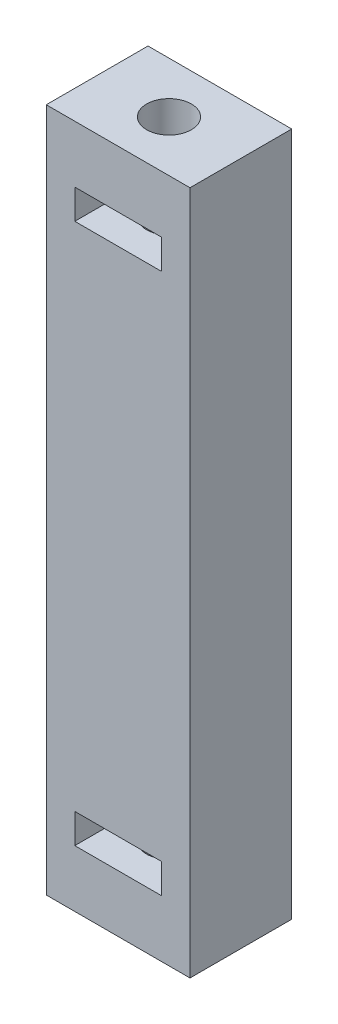
ISO-10303-21;
HEADER;
FILE_DESCRIPTION(('STEP AP214'),'2;1');
FILE_NAME('part.step','',(''),(''),'','','');
FILE_SCHEMA(('AUTOMOTIVE_DESIGN { 1 0 10303 214 1 1 1 1 }'));
ENDSEC;
DATA;
#1=APPLICATION_CONTEXT('core data for automotive mechanical design processes');
#2=APPLICATION_PROTOCOL_DEFINITION('international standard','automotive_design',2000,#1);
#3=PRODUCT_CONTEXT('',#1,'mechanical');
#4=PRODUCT('Part','Part','',(#3));
#5=PRODUCT_RELATED_PRODUCT_CATEGORY('part','',(#4));
#6=PRODUCT_DEFINITION_FORMATION('','',#4);
#7=PRODUCT_DEFINITION_CONTEXT('part definition',#1,'design');
#8=PRODUCT_DEFINITION('design','',#6,#7);
#9=PRODUCT_DEFINITION_SHAPE('','',#8);
#10=(LENGTH_UNIT() NAMED_UNIT(*) SI_UNIT(.MILLI.,.METRE.));
#11=(NAMED_UNIT(*) PLANE_ANGLE_UNIT() SI_UNIT($,.RADIAN.));
#12=(NAMED_UNIT(*) SI_UNIT($,.STERADIAN.) SOLID_ANGLE_UNIT());
#13=UNCERTAINTY_MEASURE_WITH_UNIT(LENGTH_MEASURE(1.E-05),#10,'distance_accuracy_value','');
#14=(GEOMETRIC_REPRESENTATION_CONTEXT(3) GLOBAL_UNCERTAINTY_ASSIGNED_CONTEXT((#13)) GLOBAL_UNIT_ASSIGNED_CONTEXT((#10,
#11,#12)) REPRESENTATION_CONTEXT('',''));
#15=CARTESIAN_POINT('',(0.,0.,0.));
#16=DIRECTION('',(0.,0.,1.));
#17=DIRECTION('',(1.,0.,0.));
#18=AXIS2_PLACEMENT_3D('',#15,#16,#17);
#19=CARTESIAN_POINT('',(0.,76.2,0.));
#20=DIRECTION('',(0.,1.,0.));
#21=DIRECTION('',(0.,0.,1.));
#22=AXIS2_PLACEMENT_3D('',#19,#20,#21);
#23=CYLINDRICAL_SURFACE('',#22,2.48919999999999);
#24=CARTESIAN_POINT('',(0.,69.85,0.));
#25=DIRECTION('',(0.,1.,0.));
#26=DIRECTION('',(0.,0.,1.));
#27=AXIS2_PLACEMENT_3D('',#24,#25,#26);
#28=CIRCLE('',#27,2.48919999999999);
#29=CARTESIAN_POINT('',(0.,69.85,2.48919999999999));
#30=VERTEX_POINT('',#29);
#31=EDGE_CURVE('E49',#30,#30,#28,.F.);
#32=ORIENTED_EDGE('',*,*,#31,.T.);
#33=EDGE_LOOP('',(#32));
#34=FACE_BOUND('',#33,.T.);
#35=CARTESIAN_POINT('',(0.,76.2,0.));
#36=DIRECTION('',(0.,1.,0.));
#37=DIRECTION('',(0.,0.,1.));
#38=AXIS2_PLACEMENT_3D('',#35,#36,#37);
#39=CIRCLE('',#38,2.48919999999999);
#40=CARTESIAN_POINT('',(0.,76.2,2.48919999999999));
#41=VERTEX_POINT('',#40);
#42=EDGE_CURVE('E247',#41,#41,#39,.T.);
#43=ORIENTED_EDGE('',*,*,#42,.T.);
#44=EDGE_LOOP('',(#43));
#45=FACE_BOUND('',#44,.T.);
#46=ADVANCED_FACE('F45',(#34,#45),#23,.F.);
#47=CARTESIAN_POINT('',(-8.001,76.2,-5.6642));
#48=DIRECTION('',(1.,0.,0.));
#49=DIRECTION('',(0.,0.,-1.));
#50=AXIS2_PLACEMENT_3D('',#47,#48,#49);
#51=PLANE('',#50);
#52=DIRECTION('',(0.,0.,1.));
#53=VECTOR('',#52,1.);
#54=CARTESIAN_POINT('',(-8.001,0.,-5.6642));
#55=LINE('',#54,#53);
#56=CARTESIAN_POINT('',(-8.001,0.,-5.6642));
#57=VERTEX_POINT('',#56);
#58=CARTESIAN_POINT('',(-8.001,0.,5.6642));
#59=VERTEX_POINT('',#58);
#60=EDGE_CURVE('E255',#57,#59,#55,.T.);
#61=ORIENTED_EDGE('',*,*,#60,.T.);
#62=DIRECTION('',(0.,-1.,0.));
#63=VECTOR('',#62,1.);
#64=CARTESIAN_POINT('',(-8.001,76.2,5.6642));
#65=LINE('',#64,#63);
#66=CARTESIAN_POINT('',(-8.001,76.2,5.6642));
#67=VERTEX_POINT('',#66);
#68=EDGE_CURVE('E11',#67,#59,#65,.T.);
#69=ORIENTED_EDGE('',*,*,#68,.F.);
#70=DIRECTION('',(0.,0.,1.));
#71=VECTOR('',#70,1.);
#72=CARTESIAN_POINT('',(-8.001,76.2,-5.6642));
#73=LINE('',#72,#71);
#74=CARTESIAN_POINT('',(-8.001,76.2,-5.6642));
#75=VERTEX_POINT('',#74);
#76=EDGE_CURVE('E256',#75,#67,#73,.T.);
#77=ORIENTED_EDGE('',*,*,#76,.F.);
#78=DIRECTION('',(0.,-1.,0.));
#79=VECTOR('',#78,1.);
#80=CARTESIAN_POINT('',(-8.001,76.2,-5.6642));
#81=LINE('',#80,#79);
#82=EDGE_CURVE('E270',#75,#57,#81,.T.);
#83=ORIENTED_EDGE('',*,*,#82,.T.);
#84=EDGE_LOOP('',(#61,#69,#77,#83));
#85=FACE_BOUND('',#84,.T.);
#86=ADVANCED_FACE('F47',(#85),#51,.F.);
#87=CARTESIAN_POINT('',(-8.001,76.2,5.6642));
#88=DIRECTION('',(0.,0.,-1.));
#89=DIRECTION('',(-1.,0.,0.));
#90=AXIS2_PLACEMENT_3D('',#87,#88,#89);
#91=PLANE('',#90);
#92=DIRECTION('',(1.,0.,0.));
#93=VECTOR('',#92,1.);
#94=CARTESIAN_POINT('',(-8.001,9.65200000000002,5.6642));
#95=LINE('',#94,#93);
#96=CARTESIAN_POINT('',(-4.82599999999999,9.652,5.66420000000002));
#97=VERTEX_POINT('',#96);
#98=CARTESIAN_POINT('',(4.82599999999999,9.652,5.66420000000002));
#99=VERTEX_POINT('',#98);
#100=EDGE_CURVE('E212',#97,#99,#95,.T.);
#101=ORIENTED_EDGE('',*,*,#100,.T.);
#102=DIRECTION('',(0.,-1.,0.));
#103=VECTOR('',#102,1.);
#104=CARTESIAN_POINT('',(4.82599999999999,76.2,5.6642));
#105=LINE('',#104,#103);
#106=CARTESIAN_POINT('',(4.82599999999999,6.35,5.66420000000002));
#107=VERTEX_POINT('',#106);
#108=EDGE_CURVE('E235',#99,#107,#105,.T.);
#109=ORIENTED_EDGE('',*,*,#108,.T.);
#110=DIRECTION('',(-1.,0.,0.));
#111=VECTOR('',#110,1.);
#112=CARTESIAN_POINT('',(-8.001,6.35000000000001,5.6642));
#113=LINE('',#112,#111);
#114=CARTESIAN_POINT('',(-4.82599999999999,6.35000000000001,5.6642));
#115=VERTEX_POINT('',#114);
#116=EDGE_CURVE('E208',#107,#115,#113,.T.);
#117=ORIENTED_EDGE('',*,*,#116,.T.);
#118=DIRECTION('',(0.,1.,0.));
#119=VECTOR('',#118,1.);
#120=CARTESIAN_POINT('',(-4.82599999999999,76.2,5.6642));
#121=LINE('',#120,#119);
#122=EDGE_CURVE('E148',#115,#97,#121,.T.);
#123=ORIENTED_EDGE('',*,*,#122,.T.);
#124=EDGE_LOOP('',(#101,#109,#117,#123));
#125=FACE_BOUND('',#124,.T.);
#126=DIRECTION('',(1.,0.,0.));
#127=VECTOR('',#126,1.);
#128=CARTESIAN_POINT('',(-8.001,69.85,5.6642));
#129=LINE('',#128,#127);
#130=CARTESIAN_POINT('',(-4.826,69.85,5.66420000000002));
#131=VERTEX_POINT('',#130);
#132=CARTESIAN_POINT('',(4.826,69.85,5.66420000000002));
#133=VERTEX_POINT('',#132);
#134=EDGE_CURVE('E221',#131,#133,#129,.T.);
#135=ORIENTED_EDGE('',*,*,#134,.T.);
#136=DIRECTION('',(0.,-1.,0.));
#137=VECTOR('',#136,1.);
#138=CARTESIAN_POINT('',(4.826,76.2,5.6642));
#139=LINE('',#138,#137);
#140=CARTESIAN_POINT('',(4.826,66.548,5.66420000000002));
#141=VERTEX_POINT('',#140);
#142=EDGE_CURVE('E229',#133,#141,#139,.T.);
#143=ORIENTED_EDGE('',*,*,#142,.T.);
#144=DIRECTION('',(-1.,0.,0.));
#145=VECTOR('',#144,1.);
#146=CARTESIAN_POINT('',(-8.001,66.548,5.6642));
#147=LINE('',#146,#145);
#148=CARTESIAN_POINT('',(-4.826,66.548,5.6642));
#149=VERTEX_POINT('',#148);
#150=EDGE_CURVE('E217',#141,#149,#147,.T.);
#151=ORIENTED_EDGE('',*,*,#150,.T.);
#152=DIRECTION('',(0.,1.,0.));
#153=VECTOR('',#152,1.);
#154=CARTESIAN_POINT('',(-4.826,76.2,5.6642));
#155=LINE('',#154,#153);
#156=EDGE_CURVE('E225',#149,#131,#155,.T.);
#157=ORIENTED_EDGE('',*,*,#156,.T.);
#158=EDGE_LOOP('',(#135,#143,#151,#157));
#159=FACE_BOUND('',#158,.T.);
#160=DIRECTION('',(1.,0.,0.));
#161=VECTOR('',#160,1.);
#162=CARTESIAN_POINT('',(-8.001,0.,5.6642));
#163=LINE('',#162,#161);
#164=CARTESIAN_POINT('',(8.001,0.,5.6642));
#165=VERTEX_POINT('',#164);
#166=EDGE_CURVE('E274',#59,#165,#163,.T.);
#167=ORIENTED_EDGE('',*,*,#166,.T.);
#168=DIRECTION('',(0.,-1.,0.));
#169=VECTOR('',#168,1.);
#170=CARTESIAN_POINT('',(8.001,76.2,5.6642));
#171=LINE('',#170,#169);
#172=CARTESIAN_POINT('',(8.001,76.2,5.6642));
#173=VERTEX_POINT('',#172);
#174=EDGE_CURVE('E55',#173,#165,#171,.T.);
#175=ORIENTED_EDGE('',*,*,#174,.F.);
#176=DIRECTION('',(1.,0.,0.));
#177=VECTOR('',#176,1.);
#178=CARTESIAN_POINT('',(-8.001,76.2,5.6642));
#179=LINE('',#178,#177);
#180=EDGE_CURVE('E260',#67,#173,#179,.T.);
#181=ORIENTED_EDGE('',*,*,#180,.F.);
#182=ORIENTED_EDGE('',*,*,#68,.T.);
#183=EDGE_LOOP('',(#167,#175,#181,#182));
#184=FACE_BOUND('',#183,.T.);
#185=ADVANCED_FACE('F320',(#125,#159,#184),#91,.F.);
#186=CARTESIAN_POINT('',(8.001,76.2,-5.6642));
#187=DIRECTION('',(-1.,0.,0.));
#188=DIRECTION('',(0.,0.,1.));
#189=AXIS2_PLACEMENT_3D('',#186,#187,#188);
#190=PLANE('',#189);
#191=DIRECTION('',(0.,0.,-1.));
#192=VECTOR('',#191,1.);
#193=CARTESIAN_POINT('',(8.001,0.,-5.6642));
#194=LINE('',#193,#192);
#195=CARTESIAN_POINT('',(8.001,0.,-5.6642));
#196=VERTEX_POINT('',#195);
#197=EDGE_CURVE('E277',#165,#196,#194,.T.);
#198=ORIENTED_EDGE('',*,*,#197,.T.);
#199=DIRECTION('',(0.,-1.,0.));
#200=VECTOR('',#199,1.);
#201=CARTESIAN_POINT('',(8.001,76.2,-5.6642));
#202=LINE('',#201,#200);
#203=CARTESIAN_POINT('',(8.001,76.2,-5.6642));
#204=VERTEX_POINT('',#203);
#205=EDGE_CURVE('E285',#204,#196,#202,.T.);
#206=ORIENTED_EDGE('',*,*,#205,.F.);
#207=DIRECTION('',(0.,0.,-1.));
#208=VECTOR('',#207,1.);
#209=CARTESIAN_POINT('',(8.001,76.2,-5.6642));
#210=LINE('',#209,#208);
#211=EDGE_CURVE('E264',#173,#204,#210,.T.);
#212=ORIENTED_EDGE('',*,*,#211,.F.);
#213=ORIENTED_EDGE('',*,*,#174,.T.);
#214=EDGE_LOOP('',(#198,#206,#212,#213));
#215=FACE_BOUND('',#214,.T.);
#216=ADVANCED_FACE('F367',(#215),#190,.F.);
#217=CARTESIAN_POINT('',(-8.001,76.2,-5.6642));
#218=DIRECTION('',(0.,0.,1.));
#219=DIRECTION('',(1.,0.,0.));
#220=AXIS2_PLACEMENT_3D('',#217,#218,#219);
#221=PLANE('',#220);
#222=DIRECTION('',(-1.,0.,0.));
#223=VECTOR('',#222,1.);
#224=CARTESIAN_POINT('',(4.82599999999999,6.35,-5.6642));
#225=LINE('',#224,#223);
#226=CARTESIAN_POINT('',(4.82599999999999,6.35000000000001,-5.6642));
#227=VERTEX_POINT('',#226);
#228=CARTESIAN_POINT('',(-4.82599999999999,6.35,-5.6642));
#229=VERTEX_POINT('',#228);
#230=EDGE_CURVE('E156',#227,#229,#225,.T.);
#231=ORIENTED_EDGE('',*,*,#230,.F.);
#232=DIRECTION('',(0.,-1.,0.));
#233=VECTOR('',#232,1.);
#234=CARTESIAN_POINT('',(4.82599999999999,9.652,-5.6642));
#235=LINE('',#234,#233);
#236=CARTESIAN_POINT('',(4.82599999999999,9.652,-5.6642));
#237=VERTEX_POINT('',#236);
#238=EDGE_CURVE('E162',#237,#227,#235,.T.);
#239=ORIENTED_EDGE('',*,*,#238,.F.);
#240=DIRECTION('',(1.,0.,0.));
#241=VECTOR('',#240,1.);
#242=CARTESIAN_POINT('',(4.82599999999999,9.652,-5.6642));
#243=LINE('',#242,#241);
#244=CARTESIAN_POINT('',(-4.82599999999999,9.652,-5.6642));
#245=VERTEX_POINT('',#244);
#246=EDGE_CURVE('E167',#245,#237,#243,.T.);
#247=ORIENTED_EDGE('',*,*,#246,.F.);
#248=DIRECTION('',(0.,1.,0.));
#249=VECTOR('',#248,1.);
#250=CARTESIAN_POINT('',(-4.82599999999999,9.652,-5.6642));
#251=LINE('',#250,#249);
#252=EDGE_CURVE('E145',#229,#245,#251,.T.);
#253=ORIENTED_EDGE('',*,*,#252,.F.);
#254=EDGE_LOOP('',(#231,#239,#247,#253));
#255=FACE_BOUND('',#254,.T.);
#256=DIRECTION('',(-1.,0.,0.));
#257=VECTOR('',#256,1.);
#258=CARTESIAN_POINT('',(4.826,66.548,-5.6642));
#259=LINE('',#258,#257);
#260=CARTESIAN_POINT('',(4.826,66.548,-5.6642));
#261=VERTEX_POINT('',#260);
#262=CARTESIAN_POINT('',(-4.826,66.548,-5.6642));
#263=VERTEX_POINT('',#262);
#264=EDGE_CURVE('E202',#261,#263,#259,.T.);
#265=ORIENTED_EDGE('',*,*,#264,.F.);
#266=DIRECTION('',(0.,-1.,0.));
#267=VECTOR('',#266,1.);
#268=CARTESIAN_POINT('',(4.826,69.85,-5.6642));
#269=LINE('',#268,#267);
#270=CARTESIAN_POINT('',(4.826,69.85,-5.6642));
#271=VERTEX_POINT('',#270);
#272=EDGE_CURVE('E205',#271,#261,#269,.T.);
#273=ORIENTED_EDGE('',*,*,#272,.F.);
#274=DIRECTION('',(1.,0.,0.));
#275=VECTOR('',#274,1.);
#276=CARTESIAN_POINT('',(4.826,69.85,-5.6642));
#277=LINE('',#276,#275);
#278=CARTESIAN_POINT('',(-4.826,69.85,-5.6642));
#279=VERTEX_POINT('',#278);
#280=EDGE_CURVE('E186',#279,#271,#277,.T.);
#281=ORIENTED_EDGE('',*,*,#280,.F.);
#282=DIRECTION('',(0.,1.,0.));
#283=VECTOR('',#282,1.);
#284=CARTESIAN_POINT('',(-4.826,69.85,-5.6642));
#285=LINE('',#284,#283);
#286=EDGE_CURVE('E198',#263,#279,#285,.T.);
#287=ORIENTED_EDGE('',*,*,#286,.F.);
#288=EDGE_LOOP('',(#265,#273,#281,#287));
#289=FACE_BOUND('',#288,.T.);
#290=DIRECTION('',(-1.,0.,0.));
#291=VECTOR('',#290,1.);
#292=CARTESIAN_POINT('',(-8.001,0.,-5.6642));
#293=LINE('',#292,#291);
#294=EDGE_CURVE('E261',#196,#57,#293,.T.);
#295=ORIENTED_EDGE('',*,*,#294,.T.);
#296=ORIENTED_EDGE('',*,*,#82,.F.);
#297=DIRECTION('',(-1.,0.,0.));
#298=VECTOR('',#297,1.);
#299=CARTESIAN_POINT('',(-8.001,76.2,-5.6642));
#300=LINE('',#299,#298);
#301=EDGE_CURVE('E267',#204,#75,#300,.T.);
#302=ORIENTED_EDGE('',*,*,#301,.F.);
#303=ORIENTED_EDGE('',*,*,#205,.T.);
#304=EDGE_LOOP('',(#295,#296,#302,#303));
#305=FACE_BOUND('',#304,.T.);
#306=ADVANCED_FACE('F164',(#255,#289,#305),#221,.F.);
#307=CARTESIAN_POINT('',(0.,76.2,0.));
#308=DIRECTION('',(0.,1.,0.));
#309=DIRECTION('',(0.,0.,1.));
#310=AXIS2_PLACEMENT_3D('',#307,#308,#309);
#311=PLANE('',#310);
#312=ORIENTED_EDGE('',*,*,#42,.F.);
#313=EDGE_LOOP('',(#312));
#314=FACE_BOUND('',#313,.T.);
#315=ORIENTED_EDGE('',*,*,#76,.T.);
#316=ORIENTED_EDGE('',*,*,#180,.T.);
#317=ORIENTED_EDGE('',*,*,#211,.T.);
#318=ORIENTED_EDGE('',*,*,#301,.T.);
#319=EDGE_LOOP('',(#315,#316,#317,#318));
#320=FACE_BOUND('',#319,.T.);
#321=ADVANCED_FACE('F358',(#314,#320),#311,.T.);
#322=CARTESIAN_POINT('',(0.,0.,0.));
#323=DIRECTION('',(0.,1.,0.));
#324=DIRECTION('',(0.,0.,1.));
#325=AXIS2_PLACEMENT_3D('',#322,#323,#324);
#326=PLANE('',#325);
#327=CARTESIAN_POINT('',(0.,0.,0.));
#328=DIRECTION('',(0.,-1.,0.));
#329=DIRECTION('',(0.,0.,-1.));
#330=AXIS2_PLACEMENT_3D('',#327,#328,#329);
#331=CIRCLE('',#330,2.48919999999999);
#332=CARTESIAN_POINT('',(0.,0.,-2.48919999999999));
#333=VERTEX_POINT('',#332);
#334=EDGE_CURVE('E239',#333,#333,#331,.T.);
#335=ORIENTED_EDGE('',*,*,#334,.F.);
#336=EDGE_LOOP('',(#335));
#337=FACE_BOUND('',#336,.T.);
#338=ORIENTED_EDGE('',*,*,#60,.F.);
#339=ORIENTED_EDGE('',*,*,#294,.F.);
#340=ORIENTED_EDGE('',*,*,#197,.F.);
#341=ORIENTED_EDGE('',*,*,#166,.F.);
#342=EDGE_LOOP('',(#338,#339,#340,#341));
#343=FACE_BOUND('',#342,.T.);
#344=ADVANCED_FACE('F360',(#337,#343),#326,.F.);
#345=CARTESIAN_POINT('',(0.,0.,0.));
#346=DIRECTION('',(0.,-1.,0.));
#347=DIRECTION('',(0.,0.,-1.));
#348=AXIS2_PLACEMENT_3D('',#345,#346,#347);
#349=CYLINDRICAL_SURFACE('',#348,2.48919999999999);
#350=CARTESIAN_POINT('',(0.,6.35,0.));
#351=DIRECTION('',(0.,-1.,0.));
#352=DIRECTION('',(0.,0.,-1.));
#353=AXIS2_PLACEMENT_3D('',#350,#351,#352);
#354=CIRCLE('',#353,2.48919999999999);
#355=CARTESIAN_POINT('',(0.,6.35,-2.48919999999999));
#356=VERTEX_POINT('',#355);
#357=EDGE_CURVE('E177',#356,#356,#354,.F.);
#358=ORIENTED_EDGE('',*,*,#357,.T.);
#359=EDGE_LOOP('',(#358));
#360=FACE_BOUND('',#359,.T.);
#361=ORIENTED_EDGE('',*,*,#334,.T.);
#362=EDGE_LOOP('',(#361));
#363=FACE_BOUND('',#362,.T.);
#364=ADVANCED_FACE('F363',(#360,#363),#349,.F.);
#365=CARTESIAN_POINT('',(4.82599999999999,9.652,70.5358));
#366=DIRECTION('',(1.,0.,0.));
#367=DIRECTION('',(0.,0.,-1.));
#368=AXIS2_PLACEMENT_3D('',#365,#366,#367);
#369=PLANE('',#368);
#370=DIRECTION('',(0.,0.,-1.));
#371=VECTOR('',#370,1.);
#372=CARTESIAN_POINT('',(4.82599999999999,9.652,70.5358));
#373=LINE('',#372,#371);
#374=EDGE_CURVE('E174',#99,#237,#373,.T.);
#375=ORIENTED_EDGE('',*,*,#374,.T.);
#376=ORIENTED_EDGE('',*,*,#238,.T.);
#377=DIRECTION('',(0.,0.,-1.));
#378=VECTOR('',#377,1.);
#379=CARTESIAN_POINT('',(4.82599999999999,6.35,70.5358));
#380=LINE('',#379,#378);
#381=EDGE_CURVE('E152',#107,#227,#380,.T.);
#382=ORIENTED_EDGE('',*,*,#381,.F.);
#383=ORIENTED_EDGE('',*,*,#108,.F.);
#384=EDGE_LOOP('',(#375,#376,#382,#383));
#385=FACE_BOUND('',#384,.T.);
#386=ADVANCED_FACE('F377',(#385),#369,.F.);
#387=CARTESIAN_POINT('',(-4.82599999999999,9.652,70.5358));
#388=DIRECTION('',(-1.,0.,0.));
#389=DIRECTION('',(0.,0.,1.));
#390=AXIS2_PLACEMENT_3D('',#387,#388,#389);
#391=PLANE('',#390);
#392=DIRECTION('',(0.,0.,-1.));
#393=VECTOR('',#392,1.);
#394=CARTESIAN_POINT('',(-4.82599999999999,6.35,70.5358));
#395=LINE('',#394,#393);
#396=EDGE_CURVE('E63',#115,#229,#395,.T.);
#397=ORIENTED_EDGE('',*,*,#396,.T.);
#398=ORIENTED_EDGE('',*,*,#252,.T.);
#399=DIRECTION('',(0.,0.,-1.));
#400=VECTOR('',#399,1.);
#401=CARTESIAN_POINT('',(-4.82599999999999,9.652,70.5358));
#402=LINE('',#401,#400);
#403=EDGE_CURVE('E151',#97,#245,#402,.T.);
#404=ORIENTED_EDGE('',*,*,#403,.F.);
#405=ORIENTED_EDGE('',*,*,#122,.F.);
#406=EDGE_LOOP('',(#397,#398,#404,#405));
#407=FACE_BOUND('',#406,.T.);
#408=ADVANCED_FACE('F142',(#407),#391,.F.);
#409=CARTESIAN_POINT('',(4.82599999999999,9.652,70.5358));
#410=DIRECTION('',(0.,1.,0.));
#411=DIRECTION('',(0.,0.,1.));
#412=AXIS2_PLACEMENT_3D('',#409,#410,#411);
#413=PLANE('',#412);
#414=CARTESIAN_POINT('',(0.,9.652,0.));
#415=DIRECTION('',(0.,1.,0.));
#416=DIRECTION('',(0.,0.,1.));
#417=AXIS2_PLACEMENT_3D('',#414,#415,#416);
#418=CIRCLE('',#417,2.48919999999999);
#419=CARTESIAN_POINT('',(0.,9.652,2.48919999999999));
#420=VERTEX_POINT('',#419);
#421=EDGE_CURVE('E211',#420,#420,#418,.F.);
#422=ORIENTED_EDGE('',*,*,#421,.F.);
#423=EDGE_LOOP('',(#422));
#424=FACE_BOUND('',#423,.T.);
#425=ORIENTED_EDGE('',*,*,#403,.T.);
#426=ORIENTED_EDGE('',*,*,#246,.T.);
#427=ORIENTED_EDGE('',*,*,#374,.F.);
#428=ORIENTED_EDGE('',*,*,#100,.F.);
#429=EDGE_LOOP('',(#425,#426,#427,#428));
#430=FACE_BOUND('',#429,.T.);
#431=ADVANCED_FACE('F375',(#424,#430),#413,.F.);
#432=CARTESIAN_POINT('',(4.82599999999999,6.35,70.5358));
#433=DIRECTION('',(0.,-1.,0.));
#434=DIRECTION('',(0.,0.,-1.));
#435=AXIS2_PLACEMENT_3D('',#432,#433,#434);
#436=PLANE('',#435);
#437=ORIENTED_EDGE('',*,*,#357,.F.);
#438=EDGE_LOOP('',(#437));
#439=FACE_BOUND('',#438,.T.);
#440=ORIENTED_EDGE('',*,*,#381,.T.);
#441=ORIENTED_EDGE('',*,*,#230,.T.);
#442=ORIENTED_EDGE('',*,*,#396,.F.);
#443=ORIENTED_EDGE('',*,*,#116,.F.);
#444=EDGE_LOOP('',(#440,#441,#442,#443));
#445=FACE_BOUND('',#444,.T.);
#446=ADVANCED_FACE('F157',(#439,#445),#436,.F.);
#447=CARTESIAN_POINT('',(0.,15.24,0.));
#448=DIRECTION('',(0.,-1.,0.));
#449=DIRECTION('',(0.,0.,-1.));
#450=AXIS2_PLACEMENT_3D('',#447,#448,#449);
#451=CONICAL_SURFACE('',#450,2.48919999999999,1.02974425867665);
#452=CARTESIAN_POINT('',(0.,16.7356622528834,0.));
#453=VERTEX_POINT('',#452);
#454=VERTEX_LOOP('',#453);
#455=FACE_BOUND('',#454,.T.);
#456=CARTESIAN_POINT('',(0.,15.24,0.));
#457=DIRECTION('',(0.,-1.,0.));
#458=DIRECTION('',(0.,0.,-1.));
#459=AXIS2_PLACEMENT_3D('',#456,#457,#458);
#460=CIRCLE('',#459,2.48919999999999);
#461=CARTESIAN_POINT('',(0.,15.24,-2.48919999999999));
#462=VERTEX_POINT('',#461);
#463=EDGE_CURVE('E243',#462,#462,#460,.T.);
#464=ORIENTED_EDGE('',*,*,#463,.T.);
#465=EDGE_LOOP('',(#464));
#466=FACE_BOUND('',#465,.T.);
#467=ADVANCED_FACE('F394',(#455,#466),#451,.F.);
#468=ORIENTED_EDGE('',*,*,#421,.T.);
#469=EDGE_LOOP('',(#468));
#470=FACE_BOUND('',#469,.T.);
#471=ORIENTED_EDGE('',*,*,#463,.F.);
#472=EDGE_LOOP('',(#471));
#473=FACE_BOUND('',#472,.T.);
#474=ADVANCED_FACE('F387',(#470,#473),#349,.F.);
#475=CARTESIAN_POINT('',(4.826,69.85,70.5358));
#476=DIRECTION('',(1.,0.,0.));
#477=DIRECTION('',(0.,1.,0.));
#478=AXIS2_PLACEMENT_3D('',#475,#476,#477);
#479=PLANE('',#478);
#480=DIRECTION('',(0.,0.,-1.));
#481=VECTOR('',#480,1.);
#482=CARTESIAN_POINT('',(4.826,69.85,70.5358));
#483=LINE('',#482,#481);
#484=EDGE_CURVE('E192',#133,#271,#483,.T.);
#485=ORIENTED_EDGE('',*,*,#484,.T.);
#486=ORIENTED_EDGE('',*,*,#272,.T.);
#487=DIRECTION('',(0.,0.,-1.));
#488=VECTOR('',#487,1.);
#489=CARTESIAN_POINT('',(4.826,66.548,70.5358));
#490=LINE('',#489,#488);
#491=EDGE_CURVE('E182',#141,#261,#490,.T.);
#492=ORIENTED_EDGE('',*,*,#491,.F.);
#493=ORIENTED_EDGE('',*,*,#142,.F.);
#494=EDGE_LOOP('',(#485,#486,#492,#493));
#495=FACE_BOUND('',#494,.T.);
#496=ADVANCED_FACE('F323',(#495),#479,.F.);
#497=CARTESIAN_POINT('',(-4.826,69.85,70.5358));
#498=DIRECTION('',(-1.,0.,0.));
#499=DIRECTION('',(0.,-1.,0.));
#500=AXIS2_PLACEMENT_3D('',#497,#498,#499);
#501=PLANE('',#500);
#502=DIRECTION('',(0.,0.,-1.));
#503=VECTOR('',#502,1.);
#504=CARTESIAN_POINT('',(-4.826,66.548,70.5358));
#505=LINE('',#504,#503);
#506=EDGE_CURVE('E71',#149,#263,#505,.T.);
#507=ORIENTED_EDGE('',*,*,#506,.T.);
#508=ORIENTED_EDGE('',*,*,#286,.T.);
#509=DIRECTION('',(0.,0.,-1.));
#510=VECTOR('',#509,1.);
#511=CARTESIAN_POINT('',(-4.826,69.85,70.5358));
#512=LINE('',#511,#510);
#513=EDGE_CURVE('E189',#131,#279,#512,.T.);
#514=ORIENTED_EDGE('',*,*,#513,.F.);
#515=ORIENTED_EDGE('',*,*,#156,.F.);
#516=EDGE_LOOP('',(#507,#508,#514,#515));
#517=FACE_BOUND('',#516,.T.);
#518=ADVANCED_FACE('F318',(#517),#501,.F.);
#519=CARTESIAN_POINT('',(4.826,69.85,70.5358));
#520=DIRECTION('',(0.,1.,0.));
#521=DIRECTION('',(0.,0.,1.));
#522=AXIS2_PLACEMENT_3D('',#519,#520,#521);
#523=PLANE('',#522);
#524=ORIENTED_EDGE('',*,*,#31,.F.);
#525=EDGE_LOOP('',(#524));
#526=FACE_BOUND('',#525,.T.);
#527=ORIENTED_EDGE('',*,*,#513,.T.);
#528=ORIENTED_EDGE('',*,*,#280,.T.);
#529=ORIENTED_EDGE('',*,*,#484,.F.);
#530=ORIENTED_EDGE('',*,*,#134,.F.);
#531=EDGE_LOOP('',(#527,#528,#529,#530));
#532=FACE_BOUND('',#531,.T.);
#533=ADVANCED_FACE('F307',(#526,#532),#523,.F.);
#534=CARTESIAN_POINT('',(4.826,66.548,70.5358));
#535=DIRECTION('',(0.,-1.,0.));
#536=DIRECTION('',(0.,0.,-1.));
#537=AXIS2_PLACEMENT_3D('',#534,#535,#536);
#538=PLANE('',#537);
#539=CARTESIAN_POINT('',(0.,66.548,0.));
#540=DIRECTION('',(0.,-1.,0.));
#541=DIRECTION('',(0.,0.,-1.));
#542=AXIS2_PLACEMENT_3D('',#539,#540,#541);
#543=CIRCLE('',#542,2.48919999999999);
#544=CARTESIAN_POINT('',(0.,66.548,-2.48919999999999));
#545=VERTEX_POINT('',#544);
#546=EDGE_CURVE('E216',#545,#545,#543,.F.);
#547=ORIENTED_EDGE('',*,*,#546,.F.);
#548=EDGE_LOOP('',(#547));
#549=FACE_BOUND('',#548,.T.);
#550=ORIENTED_EDGE('',*,*,#491,.T.);
#551=ORIENTED_EDGE('',*,*,#264,.T.);
#552=ORIENTED_EDGE('',*,*,#506,.F.);
#553=ORIENTED_EDGE('',*,*,#150,.F.);
#554=EDGE_LOOP('',(#550,#551,#552,#553));
#555=FACE_BOUND('',#554,.T.);
#556=ADVANCED_FACE('F304',(#549,#555),#538,.F.);
#557=CARTESIAN_POINT('',(0.,60.96,0.));
#558=DIRECTION('',(0.,1.,0.));
#559=DIRECTION('',(0.,0.,1.));
#560=AXIS2_PLACEMENT_3D('',#557,#558,#559);
#561=CONICAL_SURFACE('',#560,2.4892,1.02974425867665);
#562=CARTESIAN_POINT('',(0.,59.4643377471166,0.));
#563=VERTEX_POINT('',#562);
#564=VERTEX_LOOP('',#563);
#565=FACE_BOUND('',#564,.T.);
#566=CARTESIAN_POINT('',(0.,60.96,0.));
#567=DIRECTION('',(0.,1.,0.));
#568=DIRECTION('',(0.,0.,1.));
#569=AXIS2_PLACEMENT_3D('',#566,#567,#568);
#570=CIRCLE('',#569,2.4892);
#571=CARTESIAN_POINT('',(0.,60.96,2.4892));
#572=VERTEX_POINT('',#571);
#573=EDGE_CURVE('E251',#572,#572,#570,.T.);
#574=ORIENTED_EDGE('',*,*,#573,.T.);
#575=EDGE_LOOP('',(#574));
#576=FACE_BOUND('',#575,.T.);
#577=ADVANCED_FACE('F306',(#565,#576),#561,.F.);
#578=ORIENTED_EDGE('',*,*,#546,.T.);
#579=EDGE_LOOP('',(#578));
#580=FACE_BOUND('',#579,.T.);
#581=ORIENTED_EDGE('',*,*,#573,.F.);
#582=EDGE_LOOP('',(#581));
#583=FACE_BOUND('',#582,.T.);
#584=ADVANCED_FACE('F301',(#580,#583),#23,.F.);
#585=CLOSED_SHELL('',(#46,#86,#185,#216,#306,#321,#344,#364,#386,#408,#431,#446,#467,#474,#496,
#518,#533,#556,#577,#584));
#586=MANIFOLD_SOLID_BREP('B2',#585);
#587=ADVANCED_BREP_SHAPE_REPRESENTATION('',(#18,#586),#14);
#588=SHAPE_DEFINITION_REPRESENTATION(#9,#587);
ENDSEC;
END-ISO-10303-21;
